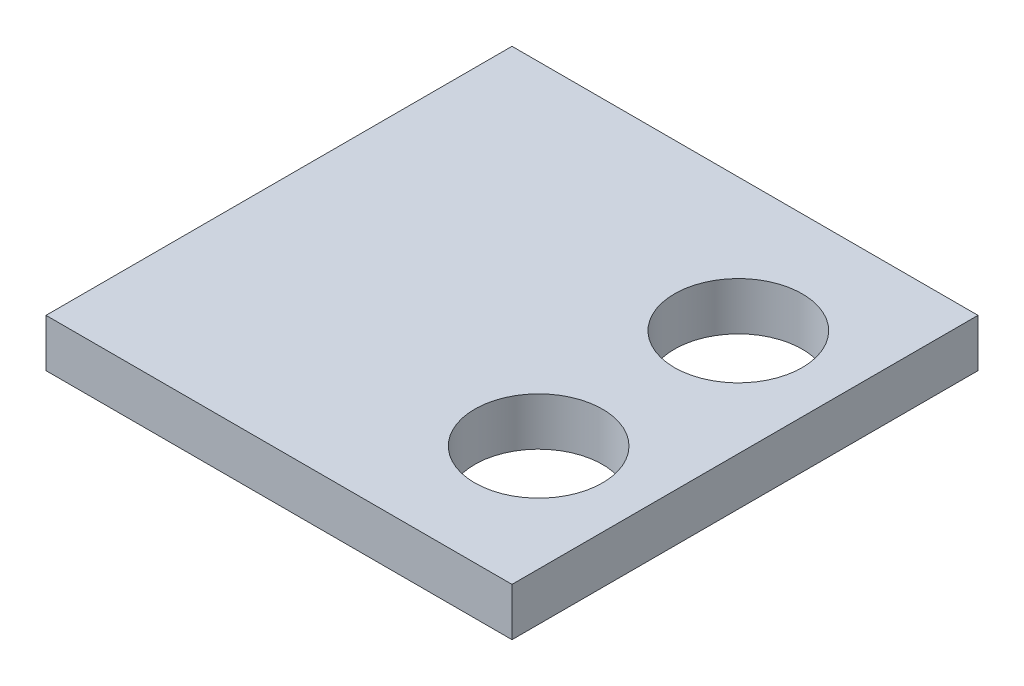
ISO-10303-21;
HEADER;
FILE_DESCRIPTION(('STEP AP214'),'2;1');
FILE_NAME('part.step','',(''),(''),'','','');
FILE_SCHEMA(('AUTOMOTIVE_DESIGN { 1 0 10303 214 1 1 1 1 }'));
ENDSEC;
DATA;
#1=APPLICATION_CONTEXT('core data for automotive mechanical design processes');
#2=APPLICATION_PROTOCOL_DEFINITION('international standard','automotive_design',2000,#1);
#3=PRODUCT_CONTEXT('',#1,'mechanical');
#4=PRODUCT('Part','Part','',(#3));
#5=PRODUCT_RELATED_PRODUCT_CATEGORY('part','',(#4));
#6=PRODUCT_DEFINITION_FORMATION('','',#4);
#7=PRODUCT_DEFINITION_CONTEXT('part definition',#1,'design');
#8=PRODUCT_DEFINITION('design','',#6,#7);
#9=PRODUCT_DEFINITION_SHAPE('','',#8);
#10=(LENGTH_UNIT() NAMED_UNIT(*) SI_UNIT(.MILLI.,.METRE.));
#11=(NAMED_UNIT(*) PLANE_ANGLE_UNIT() SI_UNIT($,.RADIAN.));
#12=(NAMED_UNIT(*) SI_UNIT($,.STERADIAN.) SOLID_ANGLE_UNIT());
#13=UNCERTAINTY_MEASURE_WITH_UNIT(LENGTH_MEASURE(1.E-05),#10,'distance_accuracy_value','');
#14=(GEOMETRIC_REPRESENTATION_CONTEXT(3) GLOBAL_UNCERTAINTY_ASSIGNED_CONTEXT((#13)) GLOBAL_UNIT_ASSIGNED_CONTEXT((#10,
#11,#12)) REPRESENTATION_CONTEXT('',''));
#15=CARTESIAN_POINT('',(0.,0.,0.));
#16=DIRECTION('',(0.,0.,1.));
#17=DIRECTION('',(1.,0.,0.));
#18=AXIS2_PLACEMENT_3D('',#15,#16,#17);
#19=CARTESIAN_POINT('',(0.,-0.9144,0.));
#20=DIRECTION('',(-1.,0.,0.));
#21=DIRECTION('',(0.,0.,1.));
#22=AXIS2_PLACEMENT_3D('',#19,#20,#21);
#23=PLANE('',#22);
#24=DIRECTION('',(0.,0.,1.));
#25=VECTOR('',#24,1.);
#26=CARTESIAN_POINT('',(0.,0.,0.));
#27=LINE('',#26,#25);
#28=CARTESIAN_POINT('',(0.,0.,-8.89));
#29=VERTEX_POINT('',#28);
#30=CARTESIAN_POINT('',(0.,0.,0.));
#31=VERTEX_POINT('',#30);
#32=EDGE_CURVE('E103',#29,#31,#27,.T.);
#33=ORIENTED_EDGE('',*,*,#32,.F.);
#34=DIRECTION('',(0.,1.,0.));
#35=VECTOR('',#34,1.);
#36=CARTESIAN_POINT('',(0.,-0.9144,-8.89));
#37=LINE('',#36,#35);
#38=CARTESIAN_POINT('',(0.,-0.9144,-8.89));
#39=VERTEX_POINT('',#38);
#40=EDGE_CURVE('E11',#39,#29,#37,.T.);
#41=ORIENTED_EDGE('',*,*,#40,.F.);
#42=DIRECTION('',(0.,0.,1.));
#43=VECTOR('',#42,1.);
#44=CARTESIAN_POINT('',(0.,-0.9144,0.));
#45=LINE('',#44,#43);
#46=CARTESIAN_POINT('',(0.,-0.9144,0.));
#47=VERTEX_POINT('',#46);
#48=EDGE_CURVE('E96',#39,#47,#45,.T.);
#49=ORIENTED_EDGE('',*,*,#48,.T.);
#50=DIRECTION('',(0.,1.,0.));
#51=VECTOR('',#50,1.);
#52=CARTESIAN_POINT('',(0.,-0.9144,0.));
#53=LINE('',#52,#51);
#54=EDGE_CURVE('E41',#47,#31,#53,.T.);
#55=ORIENTED_EDGE('',*,*,#54,.T.);
#56=EDGE_LOOP('',(#33,#41,#49,#55));
#57=FACE_BOUND('',#56,.T.);
#58=ADVANCED_FACE('F38',(#57),#23,.T.);
#59=CARTESIAN_POINT('',(0.,-0.9144,-8.89));
#60=DIRECTION('',(0.,0.,-1.));
#61=DIRECTION('',(-1.,0.,0.));
#62=AXIS2_PLACEMENT_3D('',#59,#60,#61);
#63=PLANE('',#62);
#64=DIRECTION('',(-1.,0.,0.));
#65=VECTOR('',#64,1.);
#66=CARTESIAN_POINT('',(0.,0.,-8.89));
#67=LINE('',#66,#65);
#68=CARTESIAN_POINT('',(8.89,0.,-8.89));
#69=VERTEX_POINT('',#68);
#70=EDGE_CURVE('E98',#69,#29,#67,.T.);
#71=ORIENTED_EDGE('',*,*,#70,.F.);
#72=DIRECTION('',(0.,1.,0.));
#73=VECTOR('',#72,1.);
#74=CARTESIAN_POINT('',(8.89,-0.9144,-8.89));
#75=LINE('',#74,#73);
#76=CARTESIAN_POINT('',(8.89,-0.9144,-8.89));
#77=VERTEX_POINT('',#76);
#78=EDGE_CURVE('E47',#77,#69,#75,.T.);
#79=ORIENTED_EDGE('',*,*,#78,.F.);
#80=DIRECTION('',(-1.,0.,0.));
#81=VECTOR('',#80,1.);
#82=CARTESIAN_POINT('',(0.,-0.9144,-8.89));
#83=LINE('',#82,#81);
#84=EDGE_CURVE('E93',#77,#39,#83,.T.);
#85=ORIENTED_EDGE('',*,*,#84,.T.);
#86=ORIENTED_EDGE('',*,*,#40,.T.);
#87=EDGE_LOOP('',(#71,#79,#85,#86));
#88=FACE_BOUND('',#87,.T.);
#89=ADVANCED_FACE('F114',(#88),#63,.T.);
#90=CARTESIAN_POINT('',(8.89,-0.9144,0.));
#91=DIRECTION('',(1.,0.,0.));
#92=DIRECTION('',(0.,0.,-1.));
#93=AXIS2_PLACEMENT_3D('',#90,#91,#92);
#94=PLANE('',#93);
#95=DIRECTION('',(0.,0.,-1.));
#96=VECTOR('',#95,1.);
#97=CARTESIAN_POINT('',(8.89,0.,0.));
#98=LINE('',#97,#96);
#99=CARTESIAN_POINT('',(8.89,0.,0.));
#100=VERTEX_POINT('',#99);
#101=EDGE_CURVE('E88',#100,#69,#98,.T.);
#102=ORIENTED_EDGE('',*,*,#101,.F.);
#103=DIRECTION('',(0.,1.,0.));
#104=VECTOR('',#103,1.);
#105=CARTESIAN_POINT('',(8.89,-0.9144,0.));
#106=LINE('',#105,#104);
#107=CARTESIAN_POINT('',(8.89,-0.9144,0.));
#108=VERTEX_POINT('',#107);
#109=EDGE_CURVE('E83',#108,#100,#106,.T.);
#110=ORIENTED_EDGE('',*,*,#109,.F.);
#111=DIRECTION('',(0.,0.,-1.));
#112=VECTOR('',#111,1.);
#113=CARTESIAN_POINT('',(8.89,-0.9144,0.));
#114=LINE('',#113,#112);
#115=EDGE_CURVE('E86',#108,#77,#114,.T.);
#116=ORIENTED_EDGE('',*,*,#115,.T.);
#117=ORIENTED_EDGE('',*,*,#78,.T.);
#118=EDGE_LOOP('',(#102,#110,#116,#117));
#119=FACE_BOUND('',#118,.T.);
#120=ADVANCED_FACE('F85',(#119),#94,.T.);
#121=CARTESIAN_POINT('',(0.,-0.9144,0.));
#122=DIRECTION('',(0.,0.,1.));
#123=DIRECTION('',(1.,0.,0.));
#124=AXIS2_PLACEMENT_3D('',#121,#122,#123);
#125=PLANE('',#124);
#126=DIRECTION('',(1.,0.,0.));
#127=VECTOR('',#126,1.);
#128=CARTESIAN_POINT('',(0.,0.,0.));
#129=LINE('',#128,#127);
#130=EDGE_CURVE('E106',#31,#100,#129,.T.);
#131=ORIENTED_EDGE('',*,*,#130,.F.);
#132=ORIENTED_EDGE('',*,*,#54,.F.);
#133=DIRECTION('',(1.,0.,0.));
#134=VECTOR('',#133,1.);
#135=CARTESIAN_POINT('',(0.,-0.9144,0.));
#136=LINE('',#135,#134);
#137=EDGE_CURVE('E92',#47,#108,#136,.T.);
#138=ORIENTED_EDGE('',*,*,#137,.T.);
#139=ORIENTED_EDGE('',*,*,#109,.T.);
#140=EDGE_LOOP('',(#131,#132,#138,#139));
#141=FACE_BOUND('',#140,.T.);
#142=ADVANCED_FACE('F95',(#141),#125,.T.);
#143=CARTESIAN_POINT('',(0.,-0.9144,0.));
#144=DIRECTION('',(0.,-1.,0.));
#145=DIRECTION('',(0.,0.,-1.));
#146=AXIS2_PLACEMENT_3D('',#143,#144,#145);
#147=PLANE('',#146);
#148=CARTESIAN_POINT('',(6.858,-0.9144,-2.54));
#149=DIRECTION('',(0.,1.,0.));
#150=DIRECTION('',(0.,0.,1.));
#151=AXIS2_PLACEMENT_3D('',#148,#149,#150);
#152=CIRCLE('',#151,1.2192);
#153=CARTESIAN_POINT('',(6.858,-0.9144,-1.3208));
#154=VERTEX_POINT('',#153);
#155=EDGE_CURVE('E147',#154,#154,#152,.T.);
#156=ORIENTED_EDGE('',*,*,#155,.T.);
#157=EDGE_LOOP('',(#156));
#158=FACE_BOUND('',#157,.T.);
#159=CARTESIAN_POINT('',(6.858,-0.9144,-6.35));
#160=DIRECTION('',(0.,1.,0.));
#161=DIRECTION('',(0.,0.,1.));
#162=AXIS2_PLACEMENT_3D('',#159,#160,#161);
#163=CIRCLE('',#162,1.2192);
#164=CARTESIAN_POINT('',(6.858,-0.9144,-5.1308));
#165=VERTEX_POINT('',#164);
#166=EDGE_CURVE('E107',#165,#165,#163,.T.);
#167=ORIENTED_EDGE('',*,*,#166,.T.);
#168=EDGE_LOOP('',(#167));
#169=FACE_BOUND('',#168,.T.);
#170=ORIENTED_EDGE('',*,*,#48,.F.);
#171=ORIENTED_EDGE('',*,*,#84,.F.);
#172=ORIENTED_EDGE('',*,*,#115,.F.);
#173=ORIENTED_EDGE('',*,*,#137,.F.);
#174=EDGE_LOOP('',(#170,#171,#172,#173));
#175=FACE_BOUND('',#174,.T.);
#176=ADVANCED_FACE('F91',(#158,#169,#175),#147,.T.);
#177=CARTESIAN_POINT('',(0.,0.,0.));
#178=DIRECTION('',(0.,-1.,0.));
#179=DIRECTION('',(0.,0.,-1.));
#180=AXIS2_PLACEMENT_3D('',#177,#178,#179);
#181=PLANE('',#180);
#182=CARTESIAN_POINT('',(6.858,0.,-2.54));
#183=DIRECTION('',(0.,1.,0.));
#184=DIRECTION('',(0.,0.,1.));
#185=AXIS2_PLACEMENT_3D('',#182,#183,#184);
#186=CIRCLE('',#185,1.21919999999999);
#187=CARTESIAN_POINT('',(6.858,0.,-1.32080000000001));
#188=VERTEX_POINT('',#187);
#189=EDGE_CURVE('E150',#188,#188,#186,.T.);
#190=ORIENTED_EDGE('',*,*,#189,.F.);
#191=EDGE_LOOP('',(#190));
#192=FACE_BOUND('',#191,.T.);
#193=CARTESIAN_POINT('',(6.858,0.,-6.35));
#194=DIRECTION('',(0.,1.,0.));
#195=DIRECTION('',(0.,0.,1.));
#196=AXIS2_PLACEMENT_3D('',#193,#194,#195);
#197=CIRCLE('',#196,1.21919999999999);
#198=CARTESIAN_POINT('',(6.858,0.,-5.13080000000001));
#199=VERTEX_POINT('',#198);
#200=EDGE_CURVE('E152',#199,#199,#197,.T.);
#201=ORIENTED_EDGE('',*,*,#200,.F.);
#202=EDGE_LOOP('',(#201));
#203=FACE_BOUND('',#202,.T.);
#204=ORIENTED_EDGE('',*,*,#32,.T.);
#205=ORIENTED_EDGE('',*,*,#130,.T.);
#206=ORIENTED_EDGE('',*,*,#101,.T.);
#207=ORIENTED_EDGE('',*,*,#70,.T.);
#208=EDGE_LOOP('',(#204,#205,#206,#207));
#209=FACE_BOUND('',#208,.T.);
#210=ADVANCED_FACE('F113',(#192,#203,#209),#181,.F.);
#211=CARTESIAN_POINT('',(6.858,0.,-6.35));
#212=DIRECTION('',(0.,1.,0.));
#213=DIRECTION('',(0.,0.,1.));
#214=AXIS2_PLACEMENT_3D('',#211,#212,#213);
#215=CYLINDRICAL_SURFACE('',#214,1.21919999999999);
#216=ORIENTED_EDGE('',*,*,#166,.F.);
#217=EDGE_LOOP('',(#216));
#218=FACE_BOUND('',#217,.T.);
#219=ORIENTED_EDGE('',*,*,#200,.T.);
#220=EDGE_LOOP('',(#219));
#221=FACE_BOUND('',#220,.T.);
#222=ADVANCED_FACE('F132',(#218,#221),#215,.F.);
#223=CARTESIAN_POINT('',(6.858,0.,-2.54));
#224=DIRECTION('',(0.,1.,0.));
#225=DIRECTION('',(0.,0.,1.));
#226=AXIS2_PLACEMENT_3D('',#223,#224,#225);
#227=CYLINDRICAL_SURFACE('',#226,1.21919999999999);
#228=ORIENTED_EDGE('',*,*,#155,.F.);
#229=EDGE_LOOP('',(#228));
#230=FACE_BOUND('',#229,.T.);
#231=ORIENTED_EDGE('',*,*,#189,.T.);
#232=EDGE_LOOP('',(#231));
#233=FACE_BOUND('',#232,.T.);
#234=ADVANCED_FACE('F139',(#230,#233),#227,.F.);
#235=CLOSED_SHELL('',(#58,#89,#120,#142,#176,#210,#222,#234));
#236=MANIFOLD_SOLID_BREP('B2',#235);
#237=ADVANCED_BREP_SHAPE_REPRESENTATION('',(#18,#236),#14);
#238=SHAPE_DEFINITION_REPRESENTATION(#9,#237);
ENDSEC;
END-ISO-10303-21;
